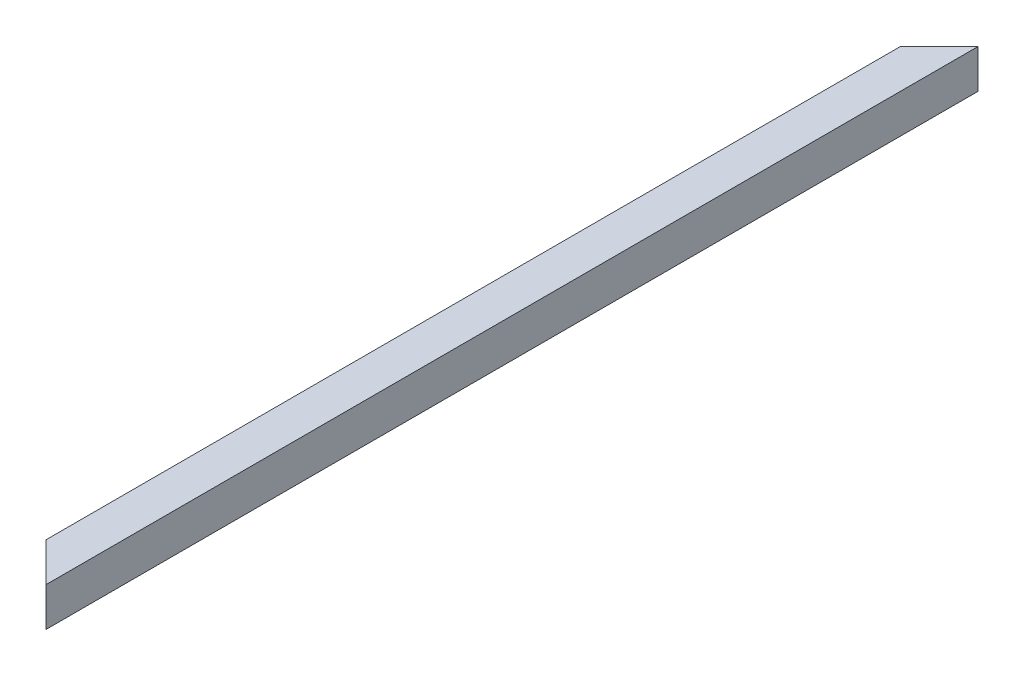
ISO-10303-21;
HEADER;
FILE_DESCRIPTION(('STEP AP214'),'2;1');
FILE_NAME('part.step','',(''),(''),'','','');
FILE_SCHEMA(('AUTOMOTIVE_DESIGN { 1 0 10303 214 1 1 1 1 }'));
ENDSEC;
DATA;
#1=APPLICATION_CONTEXT('core data for automotive mechanical design processes');
#2=APPLICATION_PROTOCOL_DEFINITION('international standard','automotive_design',2000,#1);
#3=PRODUCT_CONTEXT('',#1,'mechanical');
#4=PRODUCT('Part','Part','',(#3));
#5=PRODUCT_RELATED_PRODUCT_CATEGORY('part','',(#4));
#6=PRODUCT_DEFINITION_FORMATION('','',#4);
#7=PRODUCT_DEFINITION_CONTEXT('part definition',#1,'design');
#8=PRODUCT_DEFINITION('design','',#6,#7);
#9=PRODUCT_DEFINITION_SHAPE('','',#8);
#10=(LENGTH_UNIT() NAMED_UNIT(*) SI_UNIT(.MILLI.,.METRE.));
#11=(NAMED_UNIT(*) PLANE_ANGLE_UNIT() SI_UNIT($,.RADIAN.));
#12=(NAMED_UNIT(*) SI_UNIT($,.STERADIAN.) SOLID_ANGLE_UNIT());
#13=UNCERTAINTY_MEASURE_WITH_UNIT(LENGTH_MEASURE(1.E-05),#10,'distance_accuracy_value','');
#14=(GEOMETRIC_REPRESENTATION_CONTEXT(3) GLOBAL_UNCERTAINTY_ASSIGNED_CONTEXT((#13)) GLOBAL_UNIT_ASSIGNED_CONTEXT((#10,
#11,#12)) REPRESENTATION_CONTEXT('',''));
#15=CARTESIAN_POINT('',(0.,0.,0.));
#16=DIRECTION('',(0.,0.,1.));
#17=DIRECTION('',(1.,0.,0.));
#18=AXIS2_PLACEMENT_3D('',#15,#16,#17);
#19=CARTESIAN_POINT('',(-25.4,0.,609.6));
#20=DIRECTION('',(0.,-1.,0.));
#21=DIRECTION('',(0.,0.,-1.));
#22=AXIS2_PLACEMENT_3D('',#19,#20,#21);
#23=PLANE('',#22);
#24=DIRECTION('',(0.,0.,-1.));
#25=VECTOR('',#24,1.);
#26=CARTESIAN_POINT('',(0.,0.,609.6));
#27=LINE('',#26,#25);
#28=CARTESIAN_POINT('',(0.,0.,609.6));
#29=VERTEX_POINT('',#28);
#30=CARTESIAN_POINT('',(0.,0.,0.));
#31=VERTEX_POINT('',#30);
#32=EDGE_CURVE('E103',#29,#31,#27,.T.);
#33=ORIENTED_EDGE('',*,*,#32,.T.);
#34=DIRECTION('',(-0.707106781186548,0.,0.707106781186547));
#35=VECTOR('',#34,1.);
#36=CARTESIAN_POINT('',(-25.4,0.,25.4));
#37=LINE('',#36,#35);
#38=CARTESIAN_POINT('',(-25.4,0.,25.4000000000002));
#39=VERTEX_POINT('',#38);
#40=EDGE_CURVE('E11',#31,#39,#37,.T.);
#41=ORIENTED_EDGE('',*,*,#40,.T.);
#42=DIRECTION('',(0.,0.,-1.));
#43=VECTOR('',#42,1.);
#44=CARTESIAN_POINT('',(-25.4,0.,609.6));
#45=LINE('',#44,#43);
#46=CARTESIAN_POINT('',(-25.4,0.,584.2));
#47=VERTEX_POINT('',#46);
#48=EDGE_CURVE('E119',#47,#39,#45,.T.);
#49=ORIENTED_EDGE('',*,*,#48,.F.);
#50=DIRECTION('',(-0.707106781186545,0.,-0.70710678118655));
#51=VECTOR('',#50,1.);
#52=CARTESIAN_POINT('',(0.,0.,609.6));
#53=LINE('',#52,#51);
#54=EDGE_CURVE('E44',#47,#29,#53,.F.);
#55=ORIENTED_EDGE('',*,*,#54,.T.);
#56=EDGE_LOOP('',(#33,#41,#49,#55));
#57=FACE_BOUND('',#56,.T.);
#58=ADVANCED_FACE('F35',(#57),#23,.F.);
#59=CARTESIAN_POINT('',(-25.4,-6.35,609.6));
#60=DIRECTION('',(1.,0.,0.));
#61=DIRECTION('',(0.,1.,0.));
#62=AXIS2_PLACEMENT_3D('',#59,#60,#61);
#63=PLANE('',#62);
#64=ORIENTED_EDGE('',*,*,#48,.T.);
#65=DIRECTION('',(0.,-1.,0.));
#66=VECTOR('',#65,1.);
#67=CARTESIAN_POINT('',(-25.4,-6.35,25.4));
#68=LINE('',#67,#66);
#69=CARTESIAN_POINT('',(-25.4,-6.35,25.4000000000002));
#70=VERTEX_POINT('',#69);
#71=EDGE_CURVE('E124',#39,#70,#68,.T.);
#72=ORIENTED_EDGE('',*,*,#71,.T.);
#73=DIRECTION('',(0.,0.,-1.));
#74=VECTOR('',#73,1.);
#75=CARTESIAN_POINT('',(-25.4,-6.35,609.6));
#76=LINE('',#75,#74);
#77=CARTESIAN_POINT('',(-25.4,-6.35,584.2));
#78=VERTEX_POINT('',#77);
#79=EDGE_CURVE('E116',#78,#70,#76,.T.);
#80=ORIENTED_EDGE('',*,*,#79,.F.);
#81=DIRECTION('',(0.,1.,0.));
#82=VECTOR('',#81,1.);
#83=CARTESIAN_POINT('',(-25.4,-6.35,584.2));
#84=LINE('',#83,#82);
#85=EDGE_CURVE('E122',#78,#47,#84,.T.);
#86=ORIENTED_EDGE('',*,*,#85,.T.);
#87=EDGE_LOOP('',(#64,#72,#80,#86));
#88=FACE_BOUND('',#87,.T.);
#89=ADVANCED_FACE('F139',(#88),#63,.F.);
#90=CARTESIAN_POINT('',(-6.35,-6.35,609.6));
#91=DIRECTION('',(0.,1.,0.));
#92=DIRECTION('',(-1.,0.,0.));
#93=AXIS2_PLACEMENT_3D('',#90,#91,#92);
#94=PLANE('',#93);
#95=ORIENTED_EDGE('',*,*,#79,.T.);
#96=DIRECTION('',(0.707106781186548,0.,-0.707106781186547));
#97=VECTOR('',#96,1.);
#98=CARTESIAN_POINT('',(-25.4,-6.35,25.4));
#99=LINE('',#98,#97);
#100=CARTESIAN_POINT('',(-6.35,-6.35,6.35000000000019));
#101=VERTEX_POINT('',#100);
#102=EDGE_CURVE('E129',#70,#101,#99,.T.);
#103=ORIENTED_EDGE('',*,*,#102,.T.);
#104=DIRECTION('',(0.,0.,-1.));
#105=VECTOR('',#104,1.);
#106=CARTESIAN_POINT('',(-6.35,-6.35,609.6));
#107=LINE('',#106,#105);
#108=CARTESIAN_POINT('',(-6.35,-6.35,603.25));
#109=VERTEX_POINT('',#108);
#110=EDGE_CURVE('E114',#109,#101,#107,.T.);
#111=ORIENTED_EDGE('',*,*,#110,.F.);
#112=DIRECTION('',(0.707106781186545,0.,0.70710678118655));
#113=VECTOR('',#112,1.);
#114=CARTESIAN_POINT('',(0.,-6.35,609.6));
#115=LINE('',#114,#113);
#116=EDGE_CURVE('E127',#109,#78,#115,.F.);
#117=ORIENTED_EDGE('',*,*,#116,.T.);
#118=EDGE_LOOP('',(#95,#103,#111,#117));
#119=FACE_BOUND('',#118,.T.);
#120=ADVANCED_FACE('F142',(#119),#94,.F.);
#121=CARTESIAN_POINT('',(-6.35,-25.4,609.6));
#122=DIRECTION('',(1.,0.,0.));
#123=DIRECTION('',(0.,0.,-1.));
#124=AXIS2_PLACEMENT_3D('',#121,#122,#123);
#125=PLANE('',#124);
#126=ORIENTED_EDGE('',*,*,#110,.T.);
#127=DIRECTION('',(0.,-1.,0.));
#128=VECTOR('',#127,1.);
#129=CARTESIAN_POINT('',(-6.35,-6.35000000000001,6.34999999999999));
#130=LINE('',#129,#128);
#131=CARTESIAN_POINT('',(-6.35,-25.4,6.35000000000019));
#132=VERTEX_POINT('',#131);
#133=EDGE_CURVE('E51',#101,#132,#130,.T.);
#134=ORIENTED_EDGE('',*,*,#133,.T.);
#135=DIRECTION('',(0.,0.,-1.));
#136=VECTOR('',#135,1.);
#137=CARTESIAN_POINT('',(-6.35,-25.4,609.6));
#138=LINE('',#137,#136);
#139=CARTESIAN_POINT('',(-6.35,-25.4,603.25));
#140=VERTEX_POINT('',#139);
#141=EDGE_CURVE('E102',#140,#132,#138,.T.);
#142=ORIENTED_EDGE('',*,*,#141,.F.);
#143=DIRECTION('',(0.,-1.,0.));
#144=VECTOR('',#143,1.);
#145=CARTESIAN_POINT('',(-6.35,0.,603.25));
#146=LINE('',#145,#144);
#147=EDGE_CURVE('E93',#140,#109,#146,.F.);
#148=ORIENTED_EDGE('',*,*,#147,.T.);
#149=EDGE_LOOP('',(#126,#134,#142,#148));
#150=FACE_BOUND('',#149,.T.);
#151=ADVANCED_FACE('F144',(#150),#125,.F.);
#152=CARTESIAN_POINT('',(0.,-25.4,609.6));
#153=DIRECTION('',(0.,1.,0.));
#154=DIRECTION('',(-1.,0.,0.));
#155=AXIS2_PLACEMENT_3D('',#152,#153,#154);
#156=PLANE('',#155);
#157=ORIENTED_EDGE('',*,*,#141,.T.);
#158=DIRECTION('',(0.707106781186548,0.,-0.707106781186547));
#159=VECTOR('',#158,1.);
#160=CARTESIAN_POINT('',(-25.4,-25.4,25.4));
#161=LINE('',#160,#159);
#162=CARTESIAN_POINT('',(0.,-25.4,0.));
#163=VERTEX_POINT('',#162);
#164=EDGE_CURVE('E94',#132,#163,#161,.T.);
#165=ORIENTED_EDGE('',*,*,#164,.T.);
#166=DIRECTION('',(0.,0.,-1.));
#167=VECTOR('',#166,1.);
#168=CARTESIAN_POINT('',(0.,-25.4,609.6));
#169=LINE('',#168,#167);
#170=CARTESIAN_POINT('',(0.,-25.4,609.6));
#171=VERTEX_POINT('',#170);
#172=EDGE_CURVE('E97',#171,#163,#169,.T.);
#173=ORIENTED_EDGE('',*,*,#172,.F.);
#174=DIRECTION('',(0.707106781186545,0.,0.70710678118655));
#175=VECTOR('',#174,1.);
#176=CARTESIAN_POINT('',(0.,-25.4,609.6));
#177=LINE('',#176,#175);
#178=EDGE_CURVE('E58',#171,#140,#177,.F.);
#179=ORIENTED_EDGE('',*,*,#178,.T.);
#180=EDGE_LOOP('',(#157,#165,#173,#179));
#181=FACE_BOUND('',#180,.T.);
#182=ADVANCED_FACE('F98',(#181),#156,.F.);
#183=CARTESIAN_POINT('',(0.,0.,609.6));
#184=DIRECTION('',(-1.,0.,0.));
#185=DIRECTION('',(0.,-1.,0.));
#186=AXIS2_PLACEMENT_3D('',#183,#184,#185);
#187=PLANE('',#186);
#188=DIRECTION('',(0.,1.,0.));
#189=VECTOR('',#188,1.);
#190=CARTESIAN_POINT('',(0.,0.,0.));
#191=LINE('',#190,#189);
#192=EDGE_CURVE('E108',#163,#31,#191,.T.);
#193=ORIENTED_EDGE('',*,*,#192,.T.);
#194=ORIENTED_EDGE('',*,*,#32,.F.);
#195=DIRECTION('',(0.,1.,0.));
#196=VECTOR('',#195,1.);
#197=CARTESIAN_POINT('',(0.,0.,609.6));
#198=LINE('',#197,#196);
#199=EDGE_CURVE('E91',#171,#29,#198,.T.);
#200=ORIENTED_EDGE('',*,*,#199,.F.);
#201=ORIENTED_EDGE('',*,*,#172,.T.);
#202=EDGE_LOOP('',(#193,#194,#200,#201));
#203=FACE_BOUND('',#202,.T.);
#204=ADVANCED_FACE('F106',(#203),#187,.F.);
#205=CARTESIAN_POINT('',(-25.4,-6.35,25.4));
#206=DIRECTION('',(-0.707106781186547,0.,-0.707106781186548));
#207=DIRECTION('',(0.,1.,0.));
#208=AXIS2_PLACEMENT_3D('',#205,#206,#207);
#209=PLANE('',#208);
#210=ORIENTED_EDGE('',*,*,#40,.F.);
#211=ORIENTED_EDGE('',*,*,#192,.F.);
#212=ORIENTED_EDGE('',*,*,#164,.F.);
#213=ORIENTED_EDGE('',*,*,#133,.F.);
#214=ORIENTED_EDGE('',*,*,#102,.F.);
#215=ORIENTED_EDGE('',*,*,#71,.F.);
#216=EDGE_LOOP('',(#210,#211,#212,#213,#214,#215));
#217=FACE_BOUND('',#216,.T.);
#218=ADVANCED_FACE('F146',(#217),#209,.T.);
#219=CARTESIAN_POINT('',(0.,0.,609.6));
#220=DIRECTION('',(0.70710678118655,0.,-0.707106781186545));
#221=DIRECTION('',(0.,-1.,0.));
#222=AXIS2_PLACEMENT_3D('',#219,#220,#221);
#223=PLANE('',#222);
#224=ORIENTED_EDGE('',*,*,#54,.F.);
#225=ORIENTED_EDGE('',*,*,#85,.F.);
#226=ORIENTED_EDGE('',*,*,#116,.F.);
#227=ORIENTED_EDGE('',*,*,#147,.F.);
#228=ORIENTED_EDGE('',*,*,#178,.F.);
#229=ORIENTED_EDGE('',*,*,#199,.T.);
#230=EDGE_LOOP('',(#224,#225,#226,#227,#228,#229));
#231=FACE_BOUND('',#230,.T.);
#232=ADVANCED_FACE('F38',(#231),#223,.F.);
#233=CLOSED_SHELL('',(#58,#89,#120,#151,#182,#204,#218,#232));
#234=MANIFOLD_SOLID_BREP('B2',#233);
#235=ADVANCED_BREP_SHAPE_REPRESENTATION('',(#18,#234),#14);
#236=SHAPE_DEFINITION_REPRESENTATION(#9,#235);
ENDSEC;
END-ISO-10303-21;
